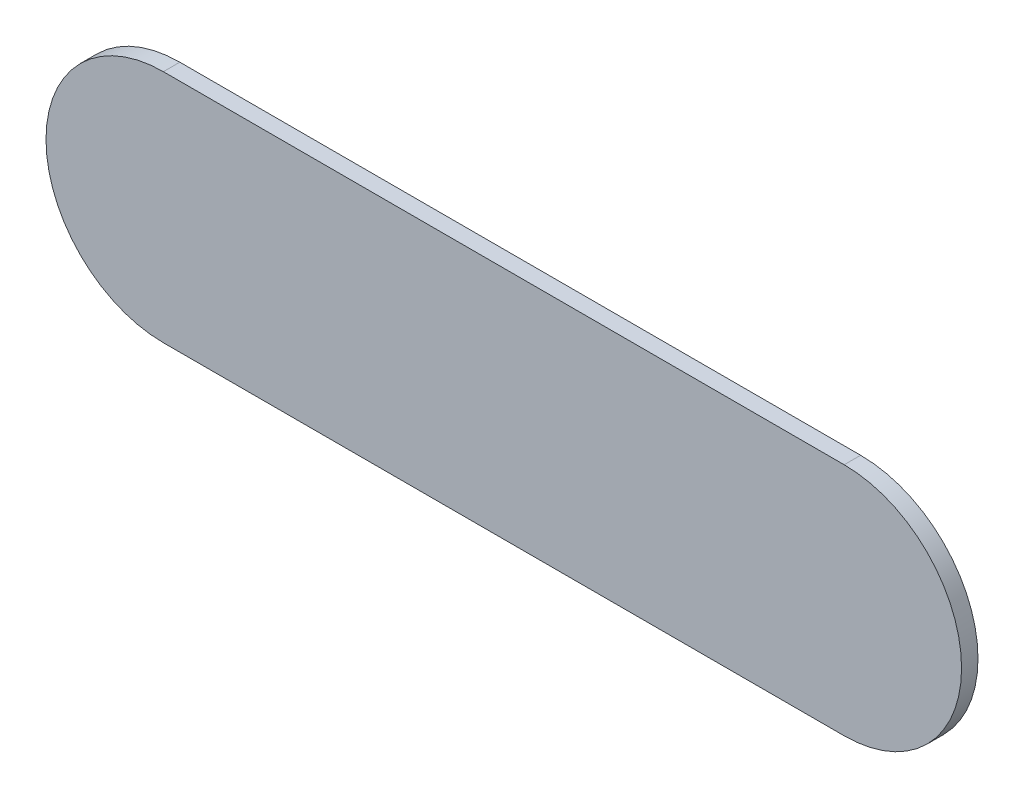
ISO-10303-21;
HEADER;
FILE_DESCRIPTION(('STEP AP214'),'2;1');
FILE_NAME('part.step','',(''),(''),'','','');
FILE_SCHEMA(('AUTOMOTIVE_DESIGN { 1 0 10303 214 1 1 1 1 }'));
ENDSEC;
DATA;
#1=APPLICATION_CONTEXT('core data for automotive mechanical design processes');
#2=APPLICATION_PROTOCOL_DEFINITION('international standard','automotive_design',2000,#1);
#3=PRODUCT_CONTEXT('',#1,'mechanical');
#4=PRODUCT('Part','Part','',(#3));
#5=PRODUCT_RELATED_PRODUCT_CATEGORY('part','',(#4));
#6=PRODUCT_DEFINITION_FORMATION('','',#4);
#7=PRODUCT_DEFINITION_CONTEXT('part definition',#1,'design');
#8=PRODUCT_DEFINITION('design','',#6,#7);
#9=PRODUCT_DEFINITION_SHAPE('','',#8);
#10=(LENGTH_UNIT() NAMED_UNIT(*) SI_UNIT(.MILLI.,.METRE.));
#11=(NAMED_UNIT(*) PLANE_ANGLE_UNIT() SI_UNIT($,.RADIAN.));
#12=(NAMED_UNIT(*) SI_UNIT($,.STERADIAN.) SOLID_ANGLE_UNIT());
#13=UNCERTAINTY_MEASURE_WITH_UNIT(LENGTH_MEASURE(1.E-05),#10,'distance_accuracy_value','');
#14=(GEOMETRIC_REPRESENTATION_CONTEXT(3) GLOBAL_UNCERTAINTY_ASSIGNED_CONTEXT((#13)) GLOBAL_UNIT_ASSIGNED_CONTEXT((#10,
#11,#12)) REPRESENTATION_CONTEXT('',''));
#15=CARTESIAN_POINT('',(0.,0.,0.));
#16=DIRECTION('',(0.,0.,1.));
#17=DIRECTION('',(1.,0.,0.));
#18=AXIS2_PLACEMENT_3D('',#15,#16,#17);
#19=CARTESIAN_POINT('',(108.2,-59.05,1.635));
#20=DIRECTION('',(0.,0.,1.));
#21=DIRECTION('',(1.,0.,0.));
#22=AXIS2_PLACEMENT_3D('',#19,#20,#21);
#23=PLANE('',#22);
#24=DIRECTION('',(1.,0.,0.));
#25=VECTOR('',#24,1.);
#26=CARTESIAN_POINT('',(108.2,-59.05,1.635));
#27=LINE('',#26,#25);
#28=CARTESIAN_POINT('',(108.2,-59.05,1.635));
#29=VERTEX_POINT('',#28);
#30=CARTESIAN_POINT('',(109.65,-59.05,1.635));
#31=VERTEX_POINT('',#30);
#32=EDGE_CURVE('E70',#29,#31,#27,.T.);
#33=ORIENTED_EDGE('',*,*,#32,.T.);
#34=CARTESIAN_POINT('',(109.65,-58.8,1.635));
#35=DIRECTION('',(0.,0.,1.));
#36=DIRECTION('',(0.,-1.,0.));
#37=AXIS2_PLACEMENT_3D('',#34,#35,#36);
#38=CIRCLE('',#37,0.25);
#39=CARTESIAN_POINT('',(109.65,-58.55,1.635));
#40=VERTEX_POINT('',#39);
#41=EDGE_CURVE('E100',#31,#40,#38,.T.);
#42=ORIENTED_EDGE('',*,*,#41,.T.);
#43=DIRECTION('',(-1.,0.,0.));
#44=VECTOR('',#43,1.);
#45=CARTESIAN_POINT('',(109.65,-58.55,1.635));
#46=LINE('',#45,#44);
#47=CARTESIAN_POINT('',(108.2,-58.55,1.635));
#48=VERTEX_POINT('',#47);
#49=EDGE_CURVE('E72',#40,#48,#46,.T.);
#50=ORIENTED_EDGE('',*,*,#49,.T.);
#51=CARTESIAN_POINT('',(108.2,-58.8,1.635));
#52=DIRECTION('',(0.,0.,1.));
#53=DIRECTION('',(0.,1.,0.));
#54=AXIS2_PLACEMENT_3D('',#51,#52,#53);
#55=CIRCLE('',#54,0.25);
#56=EDGE_CURVE('E11',#48,#29,#55,.T.);
#57=ORIENTED_EDGE('',*,*,#56,.T.);
#58=EDGE_LOOP('',(#33,#42,#50,#57));
#59=FACE_BOUND('',#58,.T.);
#60=ADVANCED_FACE('F17',(#59),#23,.T.);
#61=CARTESIAN_POINT('',(108.2,-59.05,1.6));
#62=DIRECTION('',(0.,0.,1.));
#63=DIRECTION('',(1.,0.,0.));
#64=AXIS2_PLACEMENT_3D('',#61,#62,#63);
#65=PLANE('',#64);
#66=CARTESIAN_POINT('',(108.2,-58.8,1.6));
#67=DIRECTION('',(0.,0.,1.));
#68=DIRECTION('',(0.,1.,0.));
#69=AXIS2_PLACEMENT_3D('',#66,#67,#68);
#70=CIRCLE('',#69,0.25);
#71=CARTESIAN_POINT('',(108.2,-58.55,1.6));
#72=VERTEX_POINT('',#71);
#73=CARTESIAN_POINT('',(108.2,-59.05,1.6));
#74=VERTEX_POINT('',#73);
#75=EDGE_CURVE('E26',#72,#74,#70,.T.);
#76=ORIENTED_EDGE('',*,*,#75,.F.);
#77=DIRECTION('',(-1.,0.,0.));
#78=VECTOR('',#77,1.);
#79=CARTESIAN_POINT('',(109.65,-58.55,1.6));
#80=LINE('',#79,#78);
#81=CARTESIAN_POINT('',(109.65,-58.55,1.6));
#82=VERTEX_POINT('',#81);
#83=EDGE_CURVE('E61',#82,#72,#80,.T.);
#84=ORIENTED_EDGE('',*,*,#83,.F.);
#85=CARTESIAN_POINT('',(109.65,-58.8,1.6));
#86=DIRECTION('',(0.,0.,1.));
#87=DIRECTION('',(0.,-1.,0.));
#88=AXIS2_PLACEMENT_3D('',#85,#86,#87);
#89=CIRCLE('',#88,0.25);
#90=CARTESIAN_POINT('',(109.65,-59.05,1.6));
#91=VERTEX_POINT('',#90);
#92=EDGE_CURVE('E82',#91,#82,#89,.T.);
#93=ORIENTED_EDGE('',*,*,#92,.F.);
#94=DIRECTION('',(1.,0.,0.));
#95=VECTOR('',#94,1.);
#96=CARTESIAN_POINT('',(108.2,-59.05,1.6));
#97=LINE('',#96,#95);
#98=EDGE_CURVE('E93',#74,#91,#97,.T.);
#99=ORIENTED_EDGE('',*,*,#98,.F.);
#100=EDGE_LOOP('',(#76,#84,#93,#99));
#101=FACE_BOUND('',#100,.T.);
#102=ADVANCED_FACE('F152',(#101),#65,.F.);
#103=CARTESIAN_POINT('',(108.2,-58.8,1.6));
#104=DIRECTION('',(0.,0.,-1.));
#105=DIRECTION('',(0.,1.,0.));
#106=AXIS2_PLACEMENT_3D('',#103,#104,#105);
#107=CYLINDRICAL_SURFACE('',#106,0.25);
#108=ORIENTED_EDGE('',*,*,#75,.T.);
#109=DIRECTION('',(0.,0.,1.));
#110=VECTOR('',#109,1.);
#111=CARTESIAN_POINT('',(108.2,-59.05,1.6));
#112=LINE('',#111,#110);
#113=EDGE_CURVE('E76',#74,#29,#112,.T.);
#114=ORIENTED_EDGE('',*,*,#113,.T.);
#115=ORIENTED_EDGE('',*,*,#56,.F.);
#116=DIRECTION('',(0.,0.,1.));
#117=VECTOR('',#116,1.);
#118=CARTESIAN_POINT('',(108.2,-58.55,1.6));
#119=LINE('',#118,#117);
#120=EDGE_CURVE('E99',#72,#48,#119,.T.);
#121=ORIENTED_EDGE('',*,*,#120,.F.);
#122=EDGE_LOOP('',(#108,#114,#115,#121));
#123=FACE_BOUND('',#122,.T.);
#124=ADVANCED_FACE('F77',(#123),#107,.T.);
#125=CARTESIAN_POINT('',(109.65,-58.55,1.6));
#126=DIRECTION('',(0.,-1.,0.));
#127=DIRECTION('',(0.,0.,-1.));
#128=AXIS2_PLACEMENT_3D('',#125,#126,#127);
#129=PLANE('',#128);
#130=ORIENTED_EDGE('',*,*,#83,.T.);
#131=ORIENTED_EDGE('',*,*,#120,.T.);
#132=ORIENTED_EDGE('',*,*,#49,.F.);
#133=DIRECTION('',(0.,0.,1.));
#134=VECTOR('',#133,1.);
#135=CARTESIAN_POINT('',(109.65,-58.55,1.6));
#136=LINE('',#135,#134);
#137=EDGE_CURVE('E104',#82,#40,#136,.T.);
#138=ORIENTED_EDGE('',*,*,#137,.F.);
#139=EDGE_LOOP('',(#130,#131,#132,#138));
#140=FACE_BOUND('',#139,.T.);
#141=ADVANCED_FACE('F157',(#140),#129,.F.);
#142=CARTESIAN_POINT('',(109.65,-58.8,1.6));
#143=DIRECTION('',(0.,0.,-1.));
#144=DIRECTION('',(0.,-1.,0.));
#145=AXIS2_PLACEMENT_3D('',#142,#143,#144);
#146=CYLINDRICAL_SURFACE('',#145,0.25);
#147=ORIENTED_EDGE('',*,*,#92,.T.);
#148=ORIENTED_EDGE('',*,*,#137,.T.);
#149=ORIENTED_EDGE('',*,*,#41,.F.);
#150=DIRECTION('',(0.,0.,1.));
#151=VECTOR('',#150,1.);
#152=CARTESIAN_POINT('',(109.65,-59.05,1.6));
#153=LINE('',#152,#151);
#154=EDGE_CURVE('E86',#91,#31,#153,.T.);
#155=ORIENTED_EDGE('',*,*,#154,.F.);
#156=EDGE_LOOP('',(#147,#148,#149,#155));
#157=FACE_BOUND('',#156,.T.);
#158=ADVANCED_FACE('F155',(#157),#146,.T.);
#159=CARTESIAN_POINT('',(108.2,-59.05,1.6));
#160=DIRECTION('',(0.,1.,0.));
#161=DIRECTION('',(1.,0.,0.));
#162=AXIS2_PLACEMENT_3D('',#159,#160,#161);
#163=PLANE('',#162);
#164=ORIENTED_EDGE('',*,*,#98,.T.);
#165=ORIENTED_EDGE('',*,*,#154,.T.);
#166=ORIENTED_EDGE('',*,*,#32,.F.);
#167=ORIENTED_EDGE('',*,*,#113,.F.);
#168=EDGE_LOOP('',(#164,#165,#166,#167));
#169=FACE_BOUND('',#168,.T.);
#170=ADVANCED_FACE('F84',(#169),#163,.F.);
#171=CLOSED_SHELL('',(#60,#102,#124,#141,#158,#170));
#172=MANIFOLD_SOLID_BREP('B1',#171);
#173=ADVANCED_BREP_SHAPE_REPRESENTATION('',(#18,#172),#14);
#174=SHAPE_DEFINITION_REPRESENTATION(#9,#173);
ENDSEC;
END-ISO-10303-21;
